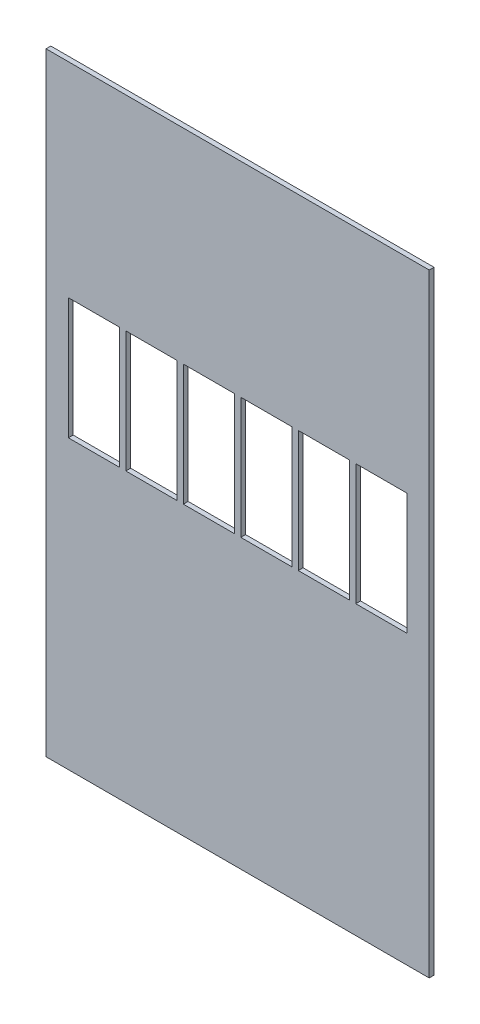
ISO-10303-21;
HEADER;
FILE_DESCRIPTION(('STEP AP214'),'2;1');
FILE_NAME('part.step','',(''),(''),'','','');
FILE_SCHEMA(('AUTOMOTIVE_DESIGN { 1 0 10303 214 1 1 1 1 }'));
ENDSEC;
DATA;
#1=APPLICATION_CONTEXT('core data for automotive mechanical design processes');
#2=APPLICATION_PROTOCOL_DEFINITION('international standard','automotive_design',2000,#1);
#3=PRODUCT_CONTEXT('',#1,'mechanical');
#4=PRODUCT('Part','Part','',(#3));
#5=PRODUCT_RELATED_PRODUCT_CATEGORY('part','',(#4));
#6=PRODUCT_DEFINITION_FORMATION('','',#4);
#7=PRODUCT_DEFINITION_CONTEXT('part definition',#1,'design');
#8=PRODUCT_DEFINITION('design','',#6,#7);
#9=PRODUCT_DEFINITION_SHAPE('','',#8);
#10=(LENGTH_UNIT() NAMED_UNIT(*) SI_UNIT(.MILLI.,.METRE.));
#11=(NAMED_UNIT(*) PLANE_ANGLE_UNIT() SI_UNIT($,.RADIAN.));
#12=(NAMED_UNIT(*) SI_UNIT($,.STERADIAN.) SOLID_ANGLE_UNIT());
#13=UNCERTAINTY_MEASURE_WITH_UNIT(LENGTH_MEASURE(1.E-05),#10,'distance_accuracy_value','');
#14=(GEOMETRIC_REPRESENTATION_CONTEXT(3) GLOBAL_UNCERTAINTY_ASSIGNED_CONTEXT((#13)) GLOBAL_UNIT_ASSIGNED_CONTEXT((#10,
#11,#12)) REPRESENTATION_CONTEXT('',''));
#15=CARTESIAN_POINT('',(0.,0.,0.));
#16=DIRECTION('',(0.,0.,1.));
#17=DIRECTION('',(1.,0.,0.));
#18=AXIS2_PLACEMENT_3D('',#15,#16,#17);
#19=CARTESIAN_POINT('',(0.,0.,38.1));
#20=DIRECTION('',(0.,0.,-1.));
#21=DIRECTION('',(-1.,0.,0.));
#22=AXIS2_PLACEMENT_3D('',#19,#20,#21);
#23=PLANE('',#22);
#24=DIRECTION('',(-1.,0.,0.));
#25=VECTOR('',#24,1.);
#26=CARTESIAN_POINT('',(0.,-482.6,38.1));
#27=LINE('',#26,#25);
#28=CARTESIAN_POINT('',(-939.8,-482.6,38.1));
#29=VERTEX_POINT('',#28);
#30=CARTESIAN_POINT('',(-1346.2,-482.6,38.1));
#31=VERTEX_POINT('',#30);
#32=EDGE_CURVE('E454',#29,#31,#27,.T.);
#33=ORIENTED_EDGE('',*,*,#32,.T.);
#34=DIRECTION('',(0.,1.,0.));
#35=VECTOR('',#34,1.);
#36=CARTESIAN_POINT('',(-1346.2,-3.09693791079649E-13,38.1));
#37=LINE('',#36,#35);
#38=CARTESIAN_POINT('',(-1346.2,482.6,38.1));
#39=VERTEX_POINT('',#38);
#40=EDGE_CURVE('E11',#31,#39,#37,.T.);
#41=ORIENTED_EDGE('',*,*,#40,.T.);
#42=DIRECTION('',(1.,0.,0.));
#43=VECTOR('',#42,1.);
#44=CARTESIAN_POINT('',(0.,482.6,38.1));
#45=LINE('',#44,#43);
#46=CARTESIAN_POINT('',(-939.8,482.6,38.1));
#47=VERTEX_POINT('',#46);
#48=EDGE_CURVE('E40',#39,#47,#45,.T.);
#49=ORIENTED_EDGE('',*,*,#48,.T.);
#50=DIRECTION('',(0.,-1.,0.));
#51=VECTOR('',#50,1.);
#52=CARTESIAN_POINT('',(-939.8,-1.08100662924028E-13,38.1));
#53=LINE('',#52,#51);
#54=EDGE_CURVE('E457',#47,#29,#53,.T.);
#55=ORIENTED_EDGE('',*,*,#54,.T.);
#56=EDGE_LOOP('',(#33,#41,#49,#55));
#57=FACE_BOUND('',#56,.T.);
#58=DIRECTION('',(-1.,0.,0.));
#59=VECTOR('',#58,1.);
#60=CARTESIAN_POINT('',(0.,-482.6,38.1));
#61=LINE('',#60,#59);
#62=CARTESIAN_POINT('',(-482.6,-482.6,38.1));
#63=VERTEX_POINT('',#62);
#64=CARTESIAN_POINT('',(-889.,-482.6,38.1));
#65=VERTEX_POINT('',#64);
#66=EDGE_CURVE('E442',#63,#65,#61,.T.);
#67=ORIENTED_EDGE('',*,*,#66,.T.);
#68=DIRECTION('',(0.,1.,0.));
#69=VECTOR('',#68,1.);
#70=CARTESIAN_POINT('',(-889.,-1.02257383847054E-13,38.1));
#71=LINE('',#70,#69);
#72=CARTESIAN_POINT('',(-889.,482.6,38.1));
#73=VERTEX_POINT('',#72);
#74=EDGE_CURVE('E451',#65,#73,#71,.T.);
#75=ORIENTED_EDGE('',*,*,#74,.T.);
#76=DIRECTION('',(1.,0.,0.));
#77=VECTOR('',#76,1.);
#78=CARTESIAN_POINT('',(0.,482.6,38.1));
#79=LINE('',#78,#77);
#80=CARTESIAN_POINT('',(-482.6,482.6,38.1));
#81=VERTEX_POINT('',#80);
#82=EDGE_CURVE('E448',#73,#81,#79,.T.);
#83=ORIENTED_EDGE('',*,*,#82,.T.);
#84=DIRECTION('',(0.,-1.,0.));
#85=VECTOR('',#84,1.);
#86=CARTESIAN_POINT('',(-482.6,0.,38.1));
#87=LINE('',#86,#85);
#88=EDGE_CURVE('E445',#81,#63,#87,.T.);
#89=ORIENTED_EDGE('',*,*,#88,.T.);
#90=EDGE_LOOP('',(#67,#75,#83,#89));
#91=FACE_BOUND('',#90,.T.);
#92=DIRECTION('',(-1.,0.,0.));
#93=VECTOR('',#92,1.);
#94=CARTESIAN_POINT('',(0.,-482.599999999999,38.1));
#95=LINE('',#94,#93);
#96=CARTESIAN_POINT('',(-25.3999999999998,-482.599999999999,38.1));
#97=VERTEX_POINT('',#96);
#98=CARTESIAN_POINT('',(-431.8,-482.599999999999,38.1));
#99=VERTEX_POINT('',#98);
#100=EDGE_CURVE('E430',#97,#99,#95,.T.);
#101=ORIENTED_EDGE('',*,*,#100,.T.);
#102=DIRECTION('',(0.,1.,0.));
#103=VECTOR('',#102,1.);
#104=CARTESIAN_POINT('',(-431.8,0.,38.1));
#105=LINE('',#104,#103);
#106=CARTESIAN_POINT('',(-431.8,482.6,38.1));
#107=VERTEX_POINT('',#106);
#108=EDGE_CURVE('E439',#99,#107,#105,.T.);
#109=ORIENTED_EDGE('',*,*,#108,.T.);
#110=DIRECTION('',(1.,0.,0.));
#111=VECTOR('',#110,1.);
#112=CARTESIAN_POINT('',(0.,482.6,38.1));
#113=LINE('',#112,#111);
#114=CARTESIAN_POINT('',(-25.3999999999998,482.6,38.1));
#115=VERTEX_POINT('',#114);
#116=EDGE_CURVE('E436',#107,#115,#113,.T.);
#117=ORIENTED_EDGE('',*,*,#116,.T.);
#118=DIRECTION('',(0.,-1.,0.));
#119=VECTOR('',#118,1.);
#120=CARTESIAN_POINT('',(-25.3999999999998,0.,38.1));
#121=LINE('',#120,#119);
#122=EDGE_CURVE('E433',#115,#97,#121,.T.);
#123=ORIENTED_EDGE('',*,*,#122,.T.);
#124=EDGE_LOOP('',(#101,#109,#117,#123));
#125=FACE_BOUND('',#124,.T.);
#126=DIRECTION('',(-1.,0.,0.));
#127=VECTOR('',#126,1.);
#128=CARTESIAN_POINT('',(0.,-482.599999999999,38.1));
#129=LINE('',#128,#127);
#130=CARTESIAN_POINT('',(431.8,-482.599999999999,38.1));
#131=VERTEX_POINT('',#130);
#132=CARTESIAN_POINT('',(25.4000000000002,-482.599999999999,38.1));
#133=VERTEX_POINT('',#132);
#134=EDGE_CURVE('E418',#131,#133,#129,.T.);
#135=ORIENTED_EDGE('',*,*,#134,.T.);
#136=DIRECTION('',(0.,1.,0.));
#137=VECTOR('',#136,1.);
#138=CARTESIAN_POINT('',(25.4000000000002,0.,38.1));
#139=LINE('',#138,#137);
#140=CARTESIAN_POINT('',(25.4000000000002,482.6,38.1));
#141=VERTEX_POINT('',#140);
#142=EDGE_CURVE('E427',#133,#141,#139,.T.);
#143=ORIENTED_EDGE('',*,*,#142,.T.);
#144=DIRECTION('',(1.,0.,0.));
#145=VECTOR('',#144,1.);
#146=CARTESIAN_POINT('',(0.,482.6,38.1));
#147=LINE('',#146,#145);
#148=CARTESIAN_POINT('',(431.8,482.6,38.1));
#149=VERTEX_POINT('',#148);
#150=EDGE_CURVE('E424',#141,#149,#147,.T.);
#151=ORIENTED_EDGE('',*,*,#150,.T.);
#152=DIRECTION('',(0.,-1.,0.));
#153=VECTOR('',#152,1.);
#154=CARTESIAN_POINT('',(431.8,0.,38.1));
#155=LINE('',#154,#153);
#156=EDGE_CURVE('E421',#149,#131,#155,.T.);
#157=ORIENTED_EDGE('',*,*,#156,.T.);
#158=EDGE_LOOP('',(#135,#143,#151,#157));
#159=FACE_BOUND('',#158,.T.);
#160=DIRECTION('',(-1.,0.,0.));
#161=VECTOR('',#160,1.);
#162=CARTESIAN_POINT('',(0.,-482.599999999999,38.1));
#163=LINE('',#162,#161);
#164=CARTESIAN_POINT('',(889.,-482.599999999999,38.1));
#165=VERTEX_POINT('',#164);
#166=CARTESIAN_POINT('',(482.6,-482.599999999999,38.1));
#167=VERTEX_POINT('',#166);
#168=EDGE_CURVE('E406',#165,#167,#163,.T.);
#169=ORIENTED_EDGE('',*,*,#168,.T.);
#170=DIRECTION('',(0.,1.,0.));
#171=VECTOR('',#170,1.);
#172=CARTESIAN_POINT('',(482.6,0.,38.1));
#173=LINE('',#172,#171);
#174=CARTESIAN_POINT('',(482.6,482.6,38.1));
#175=VERTEX_POINT('',#174);
#176=EDGE_CURVE('E415',#167,#175,#173,.T.);
#177=ORIENTED_EDGE('',*,*,#176,.T.);
#178=DIRECTION('',(1.,0.,0.));
#179=VECTOR('',#178,1.);
#180=CARTESIAN_POINT('',(0.,482.6,38.1));
#181=LINE('',#180,#179);
#182=CARTESIAN_POINT('',(889.,482.6,38.1));
#183=VERTEX_POINT('',#182);
#184=EDGE_CURVE('E412',#175,#183,#181,.T.);
#185=ORIENTED_EDGE('',*,*,#184,.T.);
#186=DIRECTION('',(0.,-1.,0.));
#187=VECTOR('',#186,1.);
#188=CARTESIAN_POINT('',(889.,0.,38.1));
#189=LINE('',#188,#187);
#190=EDGE_CURVE('E409',#183,#165,#189,.T.);
#191=ORIENTED_EDGE('',*,*,#190,.T.);
#192=EDGE_LOOP('',(#169,#177,#185,#191));
#193=FACE_BOUND('',#192,.T.);
#194=DIRECTION('',(-1.,0.,0.));
#195=VECTOR('',#194,1.);
#196=CARTESIAN_POINT('',(0.,-482.599999999999,38.1));
#197=LINE('',#196,#195);
#198=CARTESIAN_POINT('',(1346.2,-482.599999999999,38.1));
#199=VERTEX_POINT('',#198);
#200=CARTESIAN_POINT('',(939.8,-482.599999999999,38.1));
#201=VERTEX_POINT('',#200);
#202=EDGE_CURVE('E275',#199,#201,#197,.T.);
#203=ORIENTED_EDGE('',*,*,#202,.T.);
#204=DIRECTION('',(0.,1.,0.));
#205=VECTOR('',#204,1.);
#206=CARTESIAN_POINT('',(939.8,0.,38.1));
#207=LINE('',#206,#205);
#208=CARTESIAN_POINT('',(939.8,482.6,38.1));
#209=VERTEX_POINT('',#208);
#210=EDGE_CURVE('E403',#201,#209,#207,.T.);
#211=ORIENTED_EDGE('',*,*,#210,.T.);
#212=DIRECTION('',(1.,0.,0.));
#213=VECTOR('',#212,1.);
#214=CARTESIAN_POINT('',(0.,482.6,38.1));
#215=LINE('',#214,#213);
#216=CARTESIAN_POINT('',(1346.2,482.6,38.1));
#217=VERTEX_POINT('',#216);
#218=EDGE_CURVE('E400',#209,#217,#215,.T.);
#219=ORIENTED_EDGE('',*,*,#218,.T.);
#220=DIRECTION('',(0.,-1.,0.));
#221=VECTOR('',#220,1.);
#222=CARTESIAN_POINT('',(1346.2,0.,38.1));
#223=LINE('',#222,#221);
#224=EDGE_CURVE('E397',#217,#199,#223,.T.);
#225=ORIENTED_EDGE('',*,*,#224,.T.);
#226=EDGE_LOOP('',(#203,#211,#219,#225));
#227=FACE_BOUND('',#226,.T.);
#228=DIRECTION('',(-1.,0.,0.));
#229=VECTOR('',#228,1.);
#230=CARTESIAN_POINT('',(-1371.6,-2768.6,38.1));
#231=LINE('',#230,#229);
#232=CARTESIAN_POINT('',(1524.,-2768.6,38.1));
#233=VERTEX_POINT('',#232);
#234=CARTESIAN_POINT('',(-1524.,-2768.6,38.1));
#235=VERTEX_POINT('',#234);
#236=EDGE_CURVE('E256',#233,#235,#231,.T.);
#237=ORIENTED_EDGE('',*,*,#236,.F.);
#238=DIRECTION('',(0.,1.,0.));
#239=VECTOR('',#238,1.);
#240=CARTESIAN_POINT('',(1524.,2108.2,38.0999999999994));
#241=LINE('',#240,#239);
#242=CARTESIAN_POINT('',(1524.,2108.2,38.0999999999994));
#243=VERTEX_POINT('',#242);
#244=EDGE_CURVE('E240',#233,#243,#241,.T.);
#245=ORIENTED_EDGE('',*,*,#244,.T.);
#246=DIRECTION('',(1.,0.,0.));
#247=VECTOR('',#246,1.);
#248=CARTESIAN_POINT('',(-1371.6,2108.2,38.1));
#249=LINE('',#248,#247);
#250=CARTESIAN_POINT('',(-1524.,2108.2,38.0999999999994));
#251=VERTEX_POINT('',#250);
#252=EDGE_CURVE('E228',#251,#243,#249,.T.);
#253=ORIENTED_EDGE('',*,*,#252,.F.);
#254=DIRECTION('',(0.,1.,0.));
#255=VECTOR('',#254,1.);
#256=CARTESIAN_POINT('',(-1524.,2108.2,38.0999999999994));
#257=LINE('',#256,#255);
#258=EDGE_CURVE('E249',#235,#251,#257,.T.);
#259=ORIENTED_EDGE('',*,*,#258,.F.);
#260=EDGE_LOOP('',(#237,#245,#253,#259));
#261=FACE_BOUND('',#260,.T.);
#262=ADVANCED_FACE('F32',(#57,#91,#125,#159,#193,#227,#261),#23,.F.);
#263=CARTESIAN_POINT('',(0.,0.,0.));
#264=DIRECTION('',(0.,0.,-1.));
#265=DIRECTION('',(-1.,0.,0.));
#266=AXIS2_PLACEMENT_3D('',#263,#264,#265);
#267=PLANE('',#266);
#268=DIRECTION('',(0.,-1.,0.));
#269=VECTOR('',#268,1.);
#270=CARTESIAN_POINT('',(-1346.2,482.6,0.));
#271=LINE('',#270,#269);
#272=CARTESIAN_POINT('',(-1346.2,482.6,0.));
#273=VERTEX_POINT('',#272);
#274=CARTESIAN_POINT('',(-1346.2,-482.6,0.));
#275=VERTEX_POINT('',#274);
#276=EDGE_CURVE('E259',#273,#275,#271,.T.);
#277=ORIENTED_EDGE('',*,*,#276,.T.);
#278=DIRECTION('',(1.,0.,0.));
#279=VECTOR('',#278,1.);
#280=CARTESIAN_POINT('',(-1346.2,-482.6,0.));
#281=LINE('',#280,#279);
#282=CARTESIAN_POINT('',(-939.8,-482.6,0.));
#283=VERTEX_POINT('',#282);
#284=EDGE_CURVE('E262',#275,#283,#281,.T.);
#285=ORIENTED_EDGE('',*,*,#284,.T.);
#286=DIRECTION('',(0.,1.,0.));
#287=VECTOR('',#286,1.);
#288=CARTESIAN_POINT('',(-939.8,482.6,0.));
#289=LINE('',#288,#287);
#290=CARTESIAN_POINT('',(-939.8,482.6,0.));
#291=VERTEX_POINT('',#290);
#292=EDGE_CURVE('E266',#283,#291,#289,.T.);
#293=ORIENTED_EDGE('',*,*,#292,.T.);
#294=DIRECTION('',(-1.,0.,0.));
#295=VECTOR('',#294,1.);
#296=CARTESIAN_POINT('',(-1346.2,482.6,0.));
#297=LINE('',#296,#295);
#298=EDGE_CURVE('E269',#291,#273,#297,.T.);
#299=ORIENTED_EDGE('',*,*,#298,.T.);
#300=EDGE_LOOP('',(#277,#285,#293,#299));
#301=FACE_BOUND('',#300,.T.);
#302=DIRECTION('',(0.,-1.,0.));
#303=VECTOR('',#302,1.);
#304=CARTESIAN_POINT('',(-889.,482.6,0.));
#305=LINE('',#304,#303);
#306=CARTESIAN_POINT('',(-889.,482.6,0.));
#307=VERTEX_POINT('',#306);
#308=CARTESIAN_POINT('',(-889.,-482.6,0.));
#309=VERTEX_POINT('',#308);
#310=EDGE_CURVE('E283',#307,#309,#305,.T.);
#311=ORIENTED_EDGE('',*,*,#310,.T.);
#312=DIRECTION('',(1.,0.,0.));
#313=VECTOR('',#312,1.);
#314=CARTESIAN_POINT('',(-889.,-482.6,0.));
#315=LINE('',#314,#313);
#316=CARTESIAN_POINT('',(-482.6,-482.6,0.));
#317=VERTEX_POINT('',#316);
#318=EDGE_CURVE('E286',#309,#317,#315,.T.);
#319=ORIENTED_EDGE('',*,*,#318,.T.);
#320=DIRECTION('',(0.,1.,0.));
#321=VECTOR('',#320,1.);
#322=CARTESIAN_POINT('',(-482.6,482.6,0.));
#323=LINE('',#322,#321);
#324=CARTESIAN_POINT('',(-482.6,482.6,0.));
#325=VERTEX_POINT('',#324);
#326=EDGE_CURVE('E290',#317,#325,#323,.T.);
#327=ORIENTED_EDGE('',*,*,#326,.T.);
#328=DIRECTION('',(-1.,0.,0.));
#329=VECTOR('',#328,1.);
#330=CARTESIAN_POINT('',(-889.,482.6,0.));
#331=LINE('',#330,#329);
#332=EDGE_CURVE('E293',#325,#307,#331,.T.);
#333=ORIENTED_EDGE('',*,*,#332,.T.);
#334=EDGE_LOOP('',(#311,#319,#327,#333));
#335=FACE_BOUND('',#334,.T.);
#336=DIRECTION('',(0.,-1.,0.));
#337=VECTOR('',#336,1.);
#338=CARTESIAN_POINT('',(-431.8,-482.599999999999,0.));
#339=LINE('',#338,#337);
#340=CARTESIAN_POINT('',(-431.8,482.6,0.));
#341=VERTEX_POINT('',#340);
#342=CARTESIAN_POINT('',(-431.8,-482.599999999999,0.));
#343=VERTEX_POINT('',#342);
#344=EDGE_CURVE('E305',#341,#343,#339,.T.);
#345=ORIENTED_EDGE('',*,*,#344,.T.);
#346=DIRECTION('',(1.,0.,0.));
#347=VECTOR('',#346,1.);
#348=CARTESIAN_POINT('',(-431.8,-482.599999999999,0.));
#349=LINE('',#348,#347);
#350=CARTESIAN_POINT('',(-25.3999999999998,-482.599999999999,0.));
#351=VERTEX_POINT('',#350);
#352=EDGE_CURVE('E308',#343,#351,#349,.T.);
#353=ORIENTED_EDGE('',*,*,#352,.T.);
#354=DIRECTION('',(0.,1.,0.));
#355=VECTOR('',#354,1.);
#356=CARTESIAN_POINT('',(-25.3999999999998,-482.599999999999,0.));
#357=LINE('',#356,#355);
#358=CARTESIAN_POINT('',(-25.3999999999998,482.6,0.));
#359=VERTEX_POINT('',#358);
#360=EDGE_CURVE('E312',#351,#359,#357,.T.);
#361=ORIENTED_EDGE('',*,*,#360,.T.);
#362=DIRECTION('',(-1.,0.,0.));
#363=VECTOR('',#362,1.);
#364=CARTESIAN_POINT('',(-431.8,482.6,0.));
#365=LINE('',#364,#363);
#366=EDGE_CURVE('E315',#359,#341,#365,.T.);
#367=ORIENTED_EDGE('',*,*,#366,.T.);
#368=EDGE_LOOP('',(#345,#353,#361,#367));
#369=FACE_BOUND('',#368,.T.);
#370=DIRECTION('',(0.,-1.,0.));
#371=VECTOR('',#370,1.);
#372=CARTESIAN_POINT('',(25.4000000000002,-482.599999999999,0.));
#373=LINE('',#372,#371);
#374=CARTESIAN_POINT('',(25.4000000000002,482.6,0.));
#375=VERTEX_POINT('',#374);
#376=CARTESIAN_POINT('',(25.4000000000002,-482.599999999999,0.));
#377=VERTEX_POINT('',#376);
#378=EDGE_CURVE('E328',#375,#377,#373,.T.);
#379=ORIENTED_EDGE('',*,*,#378,.T.);
#380=DIRECTION('',(1.,0.,0.));
#381=VECTOR('',#380,1.);
#382=CARTESIAN_POINT('',(25.4000000000002,-482.599999999999,0.));
#383=LINE('',#382,#381);
#384=CARTESIAN_POINT('',(431.8,-482.599999999999,0.));
#385=VERTEX_POINT('',#384);
#386=EDGE_CURVE('E331',#377,#385,#383,.T.);
#387=ORIENTED_EDGE('',*,*,#386,.T.);
#388=DIRECTION('',(0.,1.,0.));
#389=VECTOR('',#388,1.);
#390=CARTESIAN_POINT('',(431.8,-482.599999999999,0.));
#391=LINE('',#390,#389);
#392=CARTESIAN_POINT('',(431.8,482.6,0.));
#393=VERTEX_POINT('',#392);
#394=EDGE_CURVE('E335',#385,#393,#391,.T.);
#395=ORIENTED_EDGE('',*,*,#394,.T.);
#396=DIRECTION('',(-1.,0.,0.));
#397=VECTOR('',#396,1.);
#398=CARTESIAN_POINT('',(25.4000000000002,482.6,0.));
#399=LINE('',#398,#397);
#400=EDGE_CURVE('E338',#393,#375,#399,.T.);
#401=ORIENTED_EDGE('',*,*,#400,.T.);
#402=EDGE_LOOP('',(#379,#387,#395,#401));
#403=FACE_BOUND('',#402,.T.);
#404=DIRECTION('',(0.,-1.,0.));
#405=VECTOR('',#404,1.);
#406=CARTESIAN_POINT('',(482.6,-482.599999999999,0.));
#407=LINE('',#406,#405);
#408=CARTESIAN_POINT('',(482.6,482.6,0.));
#409=VERTEX_POINT('',#408);
#410=CARTESIAN_POINT('',(482.6,-482.599999999999,0.));
#411=VERTEX_POINT('',#410);
#412=EDGE_CURVE('E351',#409,#411,#407,.T.);
#413=ORIENTED_EDGE('',*,*,#412,.T.);
#414=DIRECTION('',(1.,0.,0.));
#415=VECTOR('',#414,1.);
#416=CARTESIAN_POINT('',(482.6,-482.599999999999,0.));
#417=LINE('',#416,#415);
#418=CARTESIAN_POINT('',(889.,-482.599999999999,0.));
#419=VERTEX_POINT('',#418);
#420=EDGE_CURVE('E354',#411,#419,#417,.T.);
#421=ORIENTED_EDGE('',*,*,#420,.T.);
#422=DIRECTION('',(0.,1.,0.));
#423=VECTOR('',#422,1.);
#424=CARTESIAN_POINT('',(889.,-482.599999999999,0.));
#425=LINE('',#424,#423);
#426=CARTESIAN_POINT('',(889.,482.6,0.));
#427=VERTEX_POINT('',#426);
#428=EDGE_CURVE('E358',#419,#427,#425,.T.);
#429=ORIENTED_EDGE('',*,*,#428,.T.);
#430=DIRECTION('',(-1.,0.,0.));
#431=VECTOR('',#430,1.);
#432=CARTESIAN_POINT('',(482.6,482.6,0.));
#433=LINE('',#432,#431);
#434=EDGE_CURVE('E361',#427,#409,#433,.T.);
#435=ORIENTED_EDGE('',*,*,#434,.T.);
#436=EDGE_LOOP('',(#413,#421,#429,#435));
#437=FACE_BOUND('',#436,.T.);
#438=DIRECTION('',(0.,-1.,0.));
#439=VECTOR('',#438,1.);
#440=CARTESIAN_POINT('',(939.8,-482.599999999999,0.));
#441=LINE('',#440,#439);
#442=CARTESIAN_POINT('',(939.8,482.6,0.));
#443=VERTEX_POINT('',#442);
#444=CARTESIAN_POINT('',(939.8,-482.599999999999,0.));
#445=VERTEX_POINT('',#444);
#446=EDGE_CURVE('E258',#443,#445,#441,.T.);
#447=ORIENTED_EDGE('',*,*,#446,.T.);
#448=DIRECTION('',(1.,0.,0.));
#449=VECTOR('',#448,1.);
#450=CARTESIAN_POINT('',(939.8,-482.599999999999,0.));
#451=LINE('',#450,#449);
#452=CARTESIAN_POINT('',(1346.2,-482.599999999999,0.));
#453=VERTEX_POINT('',#452);
#454=EDGE_CURVE('E376',#445,#453,#451,.T.);
#455=ORIENTED_EDGE('',*,*,#454,.T.);
#456=DIRECTION('',(0.,1.,0.));
#457=VECTOR('',#456,1.);
#458=CARTESIAN_POINT('',(1346.2,-482.599999999999,0.));
#459=LINE('',#458,#457);
#460=CARTESIAN_POINT('',(1346.2,482.6,0.));
#461=VERTEX_POINT('',#460);
#462=EDGE_CURVE('E379',#453,#461,#459,.T.);
#463=ORIENTED_EDGE('',*,*,#462,.T.);
#464=DIRECTION('',(-1.,0.,0.));
#465=VECTOR('',#464,1.);
#466=CARTESIAN_POINT('',(939.8,482.6,0.));
#467=LINE('',#466,#465);
#468=EDGE_CURVE('E382',#461,#443,#467,.T.);
#469=ORIENTED_EDGE('',*,*,#468,.T.);
#470=EDGE_LOOP('',(#447,#455,#463,#469));
#471=FACE_BOUND('',#470,.T.);
#472=DIRECTION('',(-1.,0.,0.));
#473=VECTOR('',#472,1.);
#474=CARTESIAN_POINT('',(-1371.6,2108.2,0.));
#475=LINE('',#474,#473);
#476=CARTESIAN_POINT('',(1524.,2108.2,0.));
#477=VERTEX_POINT('',#476);
#478=CARTESIAN_POINT('',(-1524.,2108.2,0.));
#479=VERTEX_POINT('',#478);
#480=EDGE_CURVE('E217',#477,#479,#475,.T.);
#481=ORIENTED_EDGE('',*,*,#480,.F.);
#482=DIRECTION('',(0.,-1.,0.));
#483=VECTOR('',#482,1.);
#484=CARTESIAN_POINT('',(1524.,2108.2,0.));
#485=LINE('',#484,#483);
#486=CARTESIAN_POINT('',(1524.,-2768.6,5.97235751008181E-13));
#487=VERTEX_POINT('',#486);
#488=EDGE_CURVE('E219',#477,#487,#485,.T.);
#489=ORIENTED_EDGE('',*,*,#488,.T.);
#490=DIRECTION('',(1.,0.,0.));
#491=VECTOR('',#490,1.);
#492=CARTESIAN_POINT('',(-1371.6,-2768.6,0.));
#493=LINE('',#492,#491);
#494=CARTESIAN_POINT('',(-1524.,-2768.6,5.97235751008181E-13));
#495=VERTEX_POINT('',#494);
#496=EDGE_CURVE('E227',#495,#487,#493,.T.);
#497=ORIENTED_EDGE('',*,*,#496,.F.);
#498=DIRECTION('',(0.,-1.,0.));
#499=VECTOR('',#498,1.);
#500=CARTESIAN_POINT('',(-1524.,2108.2,0.));
#501=LINE('',#500,#499);
#502=EDGE_CURVE('E222',#479,#495,#501,.T.);
#503=ORIENTED_EDGE('',*,*,#502,.F.);
#504=EDGE_LOOP('',(#481,#489,#497,#503));
#505=FACE_BOUND('',#504,.T.);
#506=ADVANCED_FACE('F34',(#301,#335,#369,#403,#437,#471,#505),#267,.T.);
#507=CARTESIAN_POINT('',(939.8,-482.599999999999,0.));
#508=DIRECTION('',(-1.,0.,0.));
#509=DIRECTION('',(0.,0.,1.));
#510=AXIS2_PLACEMENT_3D('',#507,#508,#509);
#511=PLANE('',#510);
#512=DIRECTION('',(0.,0.,1.));
#513=VECTOR('',#512,1.);
#514=CARTESIAN_POINT('',(939.8,-482.599999999999,0.));
#515=LINE('',#514,#513);
#516=EDGE_CURVE('E385',#445,#201,#515,.T.);
#517=ORIENTED_EDGE('',*,*,#516,.F.);
#518=ORIENTED_EDGE('',*,*,#446,.F.);
#519=DIRECTION('',(0.,0.,1.));
#520=VECTOR('',#519,1.);
#521=CARTESIAN_POINT('',(939.8,482.6,0.));
#522=LINE('',#521,#520);
#523=EDGE_CURVE('E355',#443,#209,#522,.T.);
#524=ORIENTED_EDGE('',*,*,#523,.T.);
#525=ORIENTED_EDGE('',*,*,#210,.F.);
#526=EDGE_LOOP('',(#517,#518,#524,#525));
#527=FACE_BOUND('',#526,.T.);
#528=ADVANCED_FACE('F489',(#527),#511,.F.);
#529=CARTESIAN_POINT('',(939.8,482.6,0.));
#530=DIRECTION('',(0.,1.,0.));
#531=DIRECTION('',(0.,0.,1.));
#532=AXIS2_PLACEMENT_3D('',#529,#530,#531);
#533=PLANE('',#532);
#534=ORIENTED_EDGE('',*,*,#523,.F.);
#535=ORIENTED_EDGE('',*,*,#468,.F.);
#536=DIRECTION('',(0.,0.,1.));
#537=VECTOR('',#536,1.);
#538=CARTESIAN_POINT('',(1346.2,482.6,0.));
#539=LINE('',#538,#537);
#540=EDGE_CURVE('E388',#461,#217,#539,.T.);
#541=ORIENTED_EDGE('',*,*,#540,.T.);
#542=ORIENTED_EDGE('',*,*,#218,.F.);
#543=EDGE_LOOP('',(#534,#535,#541,#542));
#544=FACE_BOUND('',#543,.T.);
#545=ADVANCED_FACE('F493',(#544),#533,.F.);
#546=CARTESIAN_POINT('',(1346.2,-482.599999999999,0.));
#547=DIRECTION('',(1.,0.,0.));
#548=DIRECTION('',(0.,0.,-1.));
#549=AXIS2_PLACEMENT_3D('',#546,#547,#548);
#550=PLANE('',#549);
#551=ORIENTED_EDGE('',*,*,#540,.F.);
#552=ORIENTED_EDGE('',*,*,#462,.F.);
#553=DIRECTION('',(0.,0.,1.));
#554=VECTOR('',#553,1.);
#555=CARTESIAN_POINT('',(1346.2,-482.599999999999,0.));
#556=LINE('',#555,#554);
#557=EDGE_CURVE('E391',#453,#199,#556,.T.);
#558=ORIENTED_EDGE('',*,*,#557,.T.);
#559=ORIENTED_EDGE('',*,*,#224,.F.);
#560=EDGE_LOOP('',(#551,#552,#558,#559));
#561=FACE_BOUND('',#560,.T.);
#562=ADVANCED_FACE('F499',(#561),#550,.F.);
#563=CARTESIAN_POINT('',(939.8,-482.599999999999,0.));
#564=DIRECTION('',(0.,-1.,0.));
#565=DIRECTION('',(0.,0.,-1.));
#566=AXIS2_PLACEMENT_3D('',#563,#564,#565);
#567=PLANE('',#566);
#568=ORIENTED_EDGE('',*,*,#557,.F.);
#569=ORIENTED_EDGE('',*,*,#454,.F.);
#570=ORIENTED_EDGE('',*,*,#516,.T.);
#571=ORIENTED_EDGE('',*,*,#202,.F.);
#572=EDGE_LOOP('',(#568,#569,#570,#571));
#573=FACE_BOUND('',#572,.T.);
#574=ADVANCED_FACE('F495',(#573),#567,.F.);
#575=CARTESIAN_POINT('',(482.6,-482.599999999999,0.));
#576=DIRECTION('',(-1.,0.,0.));
#577=DIRECTION('',(0.,0.,1.));
#578=AXIS2_PLACEMENT_3D('',#575,#576,#577);
#579=PLANE('',#578);
#580=DIRECTION('',(0.,0.,1.));
#581=VECTOR('',#580,1.);
#582=CARTESIAN_POINT('',(482.6,-482.599999999999,0.));
#583=LINE('',#582,#581);
#584=EDGE_CURVE('E364',#411,#167,#583,.T.);
#585=ORIENTED_EDGE('',*,*,#584,.F.);
#586=ORIENTED_EDGE('',*,*,#412,.F.);
#587=DIRECTION('',(0.,0.,1.));
#588=VECTOR('',#587,1.);
#589=CARTESIAN_POINT('',(482.6,482.6,0.));
#590=LINE('',#589,#588);
#591=EDGE_CURVE('E332',#409,#175,#590,.T.);
#592=ORIENTED_EDGE('',*,*,#591,.T.);
#593=ORIENTED_EDGE('',*,*,#176,.F.);
#594=EDGE_LOOP('',(#585,#586,#592,#593));
#595=FACE_BOUND('',#594,.T.);
#596=ADVANCED_FACE('F498',(#595),#579,.F.);
#597=CARTESIAN_POINT('',(482.6,482.6,0.));
#598=DIRECTION('',(0.,1.,0.));
#599=DIRECTION('',(0.,0.,1.));
#600=AXIS2_PLACEMENT_3D('',#597,#598,#599);
#601=PLANE('',#600);
#602=ORIENTED_EDGE('',*,*,#591,.F.);
#603=ORIENTED_EDGE('',*,*,#434,.F.);
#604=DIRECTION('',(0.,0.,1.));
#605=VECTOR('',#604,1.);
#606=CARTESIAN_POINT('',(889.,482.6,0.));
#607=LINE('',#606,#605);
#608=EDGE_CURVE('E367',#427,#183,#607,.T.);
#609=ORIENTED_EDGE('',*,*,#608,.T.);
#610=ORIENTED_EDGE('',*,*,#184,.F.);
#611=EDGE_LOOP('',(#602,#603,#609,#610));
#612=FACE_BOUND('',#611,.T.);
#613=ADVANCED_FACE('F509',(#612),#601,.F.);
#614=CARTESIAN_POINT('',(889.,-482.599999999999,0.));
#615=DIRECTION('',(1.,0.,0.));
#616=DIRECTION('',(0.,0.,-1.));
#617=AXIS2_PLACEMENT_3D('',#614,#615,#616);
#618=PLANE('',#617);
#619=ORIENTED_EDGE('',*,*,#608,.F.);
#620=ORIENTED_EDGE('',*,*,#428,.F.);
#621=DIRECTION('',(0.,0.,1.));
#622=VECTOR('',#621,1.);
#623=CARTESIAN_POINT('',(889.,-482.599999999999,0.));
#624=LINE('',#623,#622);
#625=EDGE_CURVE('E370',#419,#165,#624,.T.);
#626=ORIENTED_EDGE('',*,*,#625,.T.);
#627=ORIENTED_EDGE('',*,*,#190,.F.);
#628=EDGE_LOOP('',(#619,#620,#626,#627));
#629=FACE_BOUND('',#628,.T.);
#630=ADVANCED_FACE('F515',(#629),#618,.F.);
#631=CARTESIAN_POINT('',(482.6,-482.599999999999,0.));
#632=DIRECTION('',(0.,-1.,0.));
#633=DIRECTION('',(0.,0.,-1.));
#634=AXIS2_PLACEMENT_3D('',#631,#632,#633);
#635=PLANE('',#634);
#636=ORIENTED_EDGE('',*,*,#625,.F.);
#637=ORIENTED_EDGE('',*,*,#420,.F.);
#638=ORIENTED_EDGE('',*,*,#584,.T.);
#639=ORIENTED_EDGE('',*,*,#168,.F.);
#640=EDGE_LOOP('',(#636,#637,#638,#639));
#641=FACE_BOUND('',#640,.T.);
#642=ADVANCED_FACE('F511',(#641),#635,.F.);
#643=CARTESIAN_POINT('',(25.4000000000002,-482.599999999999,0.));
#644=DIRECTION('',(-1.,0.,0.));
#645=DIRECTION('',(0.,0.,1.));
#646=AXIS2_PLACEMENT_3D('',#643,#644,#645);
#647=PLANE('',#646);
#648=DIRECTION('',(0.,0.,1.));
#649=VECTOR('',#648,1.);
#650=CARTESIAN_POINT('',(25.4000000000002,-482.599999999999,0.));
#651=LINE('',#650,#649);
#652=EDGE_CURVE('E341',#377,#133,#651,.T.);
#653=ORIENTED_EDGE('',*,*,#652,.F.);
#654=ORIENTED_EDGE('',*,*,#378,.F.);
#655=DIRECTION('',(0.,0.,1.));
#656=VECTOR('',#655,1.);
#657=CARTESIAN_POINT('',(25.4000000000002,482.6,0.));
#658=LINE('',#657,#656);
#659=EDGE_CURVE('E309',#375,#141,#658,.T.);
#660=ORIENTED_EDGE('',*,*,#659,.T.);
#661=ORIENTED_EDGE('',*,*,#142,.F.);
#662=EDGE_LOOP('',(#653,#654,#660,#661));
#663=FACE_BOUND('',#662,.T.);
#664=ADVANCED_FACE('F514',(#663),#647,.F.);
#665=CARTESIAN_POINT('',(25.4000000000002,482.6,0.));
#666=DIRECTION('',(0.,1.,0.));
#667=DIRECTION('',(0.,0.,1.));
#668=AXIS2_PLACEMENT_3D('',#665,#666,#667);
#669=PLANE('',#668);
#670=ORIENTED_EDGE('',*,*,#659,.F.);
#671=ORIENTED_EDGE('',*,*,#400,.F.);
#672=DIRECTION('',(0.,0.,1.));
#673=VECTOR('',#672,1.);
#674=CARTESIAN_POINT('',(431.8,482.6,0.));
#675=LINE('',#674,#673);
#676=EDGE_CURVE('E344',#393,#149,#675,.T.);
#677=ORIENTED_EDGE('',*,*,#676,.T.);
#678=ORIENTED_EDGE('',*,*,#150,.F.);
#679=EDGE_LOOP('',(#670,#671,#677,#678));
#680=FACE_BOUND('',#679,.T.);
#681=ADVANCED_FACE('F525',(#680),#669,.F.);
#682=CARTESIAN_POINT('',(431.8,-482.599999999999,0.));
#683=DIRECTION('',(1.,0.,0.));
#684=DIRECTION('',(0.,0.,-1.));
#685=AXIS2_PLACEMENT_3D('',#682,#683,#684);
#686=PLANE('',#685);
#687=ORIENTED_EDGE('',*,*,#676,.F.);
#688=ORIENTED_EDGE('',*,*,#394,.F.);
#689=DIRECTION('',(0.,0.,1.));
#690=VECTOR('',#689,1.);
#691=CARTESIAN_POINT('',(431.8,-482.599999999999,0.));
#692=LINE('',#691,#690);
#693=EDGE_CURVE('E347',#385,#131,#692,.T.);
#694=ORIENTED_EDGE('',*,*,#693,.T.);
#695=ORIENTED_EDGE('',*,*,#156,.F.);
#696=EDGE_LOOP('',(#687,#688,#694,#695));
#697=FACE_BOUND('',#696,.T.);
#698=ADVANCED_FACE('F531',(#697),#686,.F.);
#699=CARTESIAN_POINT('',(25.4000000000002,-482.599999999999,0.));
#700=DIRECTION('',(0.,-1.,0.));
#701=DIRECTION('',(0.,0.,-1.));
#702=AXIS2_PLACEMENT_3D('',#699,#700,#701);
#703=PLANE('',#702);
#704=ORIENTED_EDGE('',*,*,#693,.F.);
#705=ORIENTED_EDGE('',*,*,#386,.F.);
#706=ORIENTED_EDGE('',*,*,#652,.T.);
#707=ORIENTED_EDGE('',*,*,#134,.F.);
#708=EDGE_LOOP('',(#704,#705,#706,#707));
#709=FACE_BOUND('',#708,.T.);
#710=ADVANCED_FACE('F527',(#709),#703,.F.);
#711=CARTESIAN_POINT('',(-431.8,-482.599999999999,0.));
#712=DIRECTION('',(-1.,0.,0.));
#713=DIRECTION('',(0.,0.,1.));
#714=AXIS2_PLACEMENT_3D('',#711,#712,#713);
#715=PLANE('',#714);
#716=DIRECTION('',(0.,0.,1.));
#717=VECTOR('',#716,1.);
#718=CARTESIAN_POINT('',(-431.8,-482.599999999999,0.));
#719=LINE('',#718,#717);
#720=EDGE_CURVE('E318',#343,#99,#719,.T.);
#721=ORIENTED_EDGE('',*,*,#720,.F.);
#722=ORIENTED_EDGE('',*,*,#344,.F.);
#723=DIRECTION('',(0.,0.,1.));
#724=VECTOR('',#723,1.);
#725=CARTESIAN_POINT('',(-431.8,482.6,0.));
#726=LINE('',#725,#724);
#727=EDGE_CURVE('E287',#341,#107,#726,.T.);
#728=ORIENTED_EDGE('',*,*,#727,.T.);
#729=ORIENTED_EDGE('',*,*,#108,.F.);
#730=EDGE_LOOP('',(#721,#722,#728,#729));
#731=FACE_BOUND('',#730,.T.);
#732=ADVANCED_FACE('F530',(#731),#715,.F.);
#733=CARTESIAN_POINT('',(-431.8,482.6,0.));
#734=DIRECTION('',(0.,1.,0.));
#735=DIRECTION('',(0.,0.,1.));
#736=AXIS2_PLACEMENT_3D('',#733,#734,#735);
#737=PLANE('',#736);
#738=ORIENTED_EDGE('',*,*,#727,.F.);
#739=ORIENTED_EDGE('',*,*,#366,.F.);
#740=DIRECTION('',(0.,0.,1.));
#741=VECTOR('',#740,1.);
#742=CARTESIAN_POINT('',(-25.3999999999998,482.6,0.));
#743=LINE('',#742,#741);
#744=EDGE_CURVE('E321',#359,#115,#743,.T.);
#745=ORIENTED_EDGE('',*,*,#744,.T.);
#746=ORIENTED_EDGE('',*,*,#116,.F.);
#747=EDGE_LOOP('',(#738,#739,#745,#746));
#748=FACE_BOUND('',#747,.T.);
#749=ADVANCED_FACE('F541',(#748),#737,.F.);
#750=CARTESIAN_POINT('',(-25.3999999999998,-482.599999999999,0.));
#751=DIRECTION('',(1.,0.,0.));
#752=DIRECTION('',(0.,0.,-1.));
#753=AXIS2_PLACEMENT_3D('',#750,#751,#752);
#754=PLANE('',#753);
#755=ORIENTED_EDGE('',*,*,#744,.F.);
#756=ORIENTED_EDGE('',*,*,#360,.F.);
#757=DIRECTION('',(0.,0.,1.));
#758=VECTOR('',#757,1.);
#759=CARTESIAN_POINT('',(-25.3999999999998,-482.599999999999,0.));
#760=LINE('',#759,#758);
#761=EDGE_CURVE('E324',#351,#97,#760,.T.);
#762=ORIENTED_EDGE('',*,*,#761,.T.);
#763=ORIENTED_EDGE('',*,*,#122,.F.);
#764=EDGE_LOOP('',(#755,#756,#762,#763));
#765=FACE_BOUND('',#764,.T.);
#766=ADVANCED_FACE('F547',(#765),#754,.F.);
#767=CARTESIAN_POINT('',(-431.8,-482.599999999999,0.));
#768=DIRECTION('',(0.,-1.,0.));
#769=DIRECTION('',(0.,0.,-1.));
#770=AXIS2_PLACEMENT_3D('',#767,#768,#769);
#771=PLANE('',#770);
#772=ORIENTED_EDGE('',*,*,#761,.F.);
#773=ORIENTED_EDGE('',*,*,#352,.F.);
#774=ORIENTED_EDGE('',*,*,#720,.T.);
#775=ORIENTED_EDGE('',*,*,#100,.F.);
#776=EDGE_LOOP('',(#772,#773,#774,#775));
#777=FACE_BOUND('',#776,.T.);
#778=ADVANCED_FACE('F543',(#777),#771,.F.);
#779=CARTESIAN_POINT('',(-889.,482.6,0.));
#780=DIRECTION('',(-1.,0.,0.));
#781=DIRECTION('',(0.,-1.,0.));
#782=AXIS2_PLACEMENT_3D('',#779,#780,#781);
#783=PLANE('',#782);
#784=DIRECTION('',(0.,0.,1.));
#785=VECTOR('',#784,1.);
#786=CARTESIAN_POINT('',(-889.,-482.6,0.));
#787=LINE('',#786,#785);
#788=EDGE_CURVE('E55',#309,#65,#787,.T.);
#789=ORIENTED_EDGE('',*,*,#788,.F.);
#790=ORIENTED_EDGE('',*,*,#310,.F.);
#791=DIRECTION('',(0.,0.,1.));
#792=VECTOR('',#791,1.);
#793=CARTESIAN_POINT('',(-889.,482.6,0.));
#794=LINE('',#793,#792);
#795=EDGE_CURVE('E263',#307,#73,#794,.T.);
#796=ORIENTED_EDGE('',*,*,#795,.T.);
#797=ORIENTED_EDGE('',*,*,#74,.F.);
#798=EDGE_LOOP('',(#789,#790,#796,#797));
#799=FACE_BOUND('',#798,.T.);
#800=ADVANCED_FACE('F546',(#799),#783,.F.);
#801=CARTESIAN_POINT('',(-889.,482.6,0.));
#802=DIRECTION('',(0.,1.,0.));
#803=DIRECTION('',(-1.,0.,0.));
#804=AXIS2_PLACEMENT_3D('',#801,#802,#803);
#805=PLANE('',#804);
#806=ORIENTED_EDGE('',*,*,#795,.F.);
#807=ORIENTED_EDGE('',*,*,#332,.F.);
#808=DIRECTION('',(0.,0.,1.));
#809=VECTOR('',#808,1.);
#810=CARTESIAN_POINT('',(-482.6,482.6,0.));
#811=LINE('',#810,#809);
#812=EDGE_CURVE('E298',#325,#81,#811,.T.);
#813=ORIENTED_EDGE('',*,*,#812,.T.);
#814=ORIENTED_EDGE('',*,*,#82,.F.);
#815=EDGE_LOOP('',(#806,#807,#813,#814));
#816=FACE_BOUND('',#815,.T.);
#817=ADVANCED_FACE('F557',(#816),#805,.F.);
#818=CARTESIAN_POINT('',(-482.6,482.6,0.));
#819=DIRECTION('',(1.,0.,0.));
#820=DIRECTION('',(0.,1.,0.));
#821=AXIS2_PLACEMENT_3D('',#818,#819,#820);
#822=PLANE('',#821);
#823=ORIENTED_EDGE('',*,*,#812,.F.);
#824=ORIENTED_EDGE('',*,*,#326,.F.);
#825=DIRECTION('',(0.,0.,1.));
#826=VECTOR('',#825,1.);
#827=CARTESIAN_POINT('',(-482.6,-482.6,0.));
#828=LINE('',#827,#826);
#829=EDGE_CURVE('E301',#317,#63,#828,.T.);
#830=ORIENTED_EDGE('',*,*,#829,.T.);
#831=ORIENTED_EDGE('',*,*,#88,.F.);
#832=EDGE_LOOP('',(#823,#824,#830,#831));
#833=FACE_BOUND('',#832,.T.);
#834=ADVANCED_FACE('F562',(#833),#822,.F.);
#835=CARTESIAN_POINT('',(-889.,-482.6,0.));
#836=DIRECTION('',(0.,-1.,0.));
#837=DIRECTION('',(0.,0.,-1.));
#838=AXIS2_PLACEMENT_3D('',#835,#836,#837);
#839=PLANE('',#838);
#840=ORIENTED_EDGE('',*,*,#829,.F.);
#841=ORIENTED_EDGE('',*,*,#318,.F.);
#842=ORIENTED_EDGE('',*,*,#788,.T.);
#843=ORIENTED_EDGE('',*,*,#66,.F.);
#844=EDGE_LOOP('',(#840,#841,#842,#843));
#845=FACE_BOUND('',#844,.T.);
#846=ADVANCED_FACE('F559',(#845),#839,.F.);
#847=CARTESIAN_POINT('',(-1346.2,482.6,0.));
#848=DIRECTION('',(-1.,0.,0.));
#849=DIRECTION('',(0.,-1.,0.));
#850=AXIS2_PLACEMENT_3D('',#847,#848,#849);
#851=PLANE('',#850);
#852=DIRECTION('',(0.,0.,1.));
#853=VECTOR('',#852,1.);
#854=CARTESIAN_POINT('',(-1346.2,-482.6,0.));
#855=LINE('',#854,#853);
#856=EDGE_CURVE('E47',#275,#31,#855,.T.);
#857=ORIENTED_EDGE('',*,*,#856,.F.);
#858=ORIENTED_EDGE('',*,*,#276,.F.);
#859=DIRECTION('',(0.,0.,1.));
#860=VECTOR('',#859,1.);
#861=CARTESIAN_POINT('',(-1346.2,482.6,0.));
#862=LINE('',#861,#860);
#863=EDGE_CURVE('E272',#273,#39,#862,.T.);
#864=ORIENTED_EDGE('',*,*,#863,.T.);
#865=ORIENTED_EDGE('',*,*,#40,.F.);
#866=EDGE_LOOP('',(#857,#858,#864,#865));
#867=FACE_BOUND('',#866,.T.);
#868=ADVANCED_FACE('F467',(#867),#851,.F.);
#869=CARTESIAN_POINT('',(-1346.2,482.6,0.));
#870=DIRECTION('',(0.,1.,0.));
#871=DIRECTION('',(0.,0.,1.));
#872=AXIS2_PLACEMENT_3D('',#869,#870,#871);
#873=PLANE('',#872);
#874=ORIENTED_EDGE('',*,*,#863,.F.);
#875=ORIENTED_EDGE('',*,*,#298,.F.);
#876=DIRECTION('',(0.,0.,1.));
#877=VECTOR('',#876,1.);
#878=CARTESIAN_POINT('',(-939.8,482.6,0.));
#879=LINE('',#878,#877);
#880=EDGE_CURVE('E276',#291,#47,#879,.T.);
#881=ORIENTED_EDGE('',*,*,#880,.T.);
#882=ORIENTED_EDGE('',*,*,#48,.F.);
#883=EDGE_LOOP('',(#874,#875,#881,#882));
#884=FACE_BOUND('',#883,.T.);
#885=ADVANCED_FACE('F463',(#884),#873,.F.);
#886=CARTESIAN_POINT('',(-939.8,482.6,0.));
#887=DIRECTION('',(1.,0.,0.));
#888=DIRECTION('',(0.,1.,0.));
#889=AXIS2_PLACEMENT_3D('',#886,#887,#888);
#890=PLANE('',#889);
#891=ORIENTED_EDGE('',*,*,#880,.F.);
#892=ORIENTED_EDGE('',*,*,#292,.F.);
#893=DIRECTION('',(0.,0.,1.));
#894=VECTOR('',#893,1.);
#895=CARTESIAN_POINT('',(-939.8,-482.6,0.));
#896=LINE('',#895,#894);
#897=EDGE_CURVE('E279',#283,#29,#896,.T.);
#898=ORIENTED_EDGE('',*,*,#897,.T.);
#899=ORIENTED_EDGE('',*,*,#54,.F.);
#900=EDGE_LOOP('',(#891,#892,#898,#899));
#901=FACE_BOUND('',#900,.T.);
#902=ADVANCED_FACE('F472',(#901),#890,.F.);
#903=CARTESIAN_POINT('',(-1346.2,-482.6,0.));
#904=DIRECTION('',(0.,-1.,0.));
#905=DIRECTION('',(0.,0.,-1.));
#906=AXIS2_PLACEMENT_3D('',#903,#904,#905);
#907=PLANE('',#906);
#908=ORIENTED_EDGE('',*,*,#897,.F.);
#909=ORIENTED_EDGE('',*,*,#284,.F.);
#910=ORIENTED_EDGE('',*,*,#856,.T.);
#911=ORIENTED_EDGE('',*,*,#32,.F.);
#912=EDGE_LOOP('',(#908,#909,#910,#911));
#913=FACE_BOUND('',#912,.T.);
#914=ADVANCED_FACE('F473',(#913),#907,.F.);
#915=CARTESIAN_POINT('',(0.,-2768.6,0.));
#916=DIRECTION('',(0.,1.,0.));
#917=DIRECTION('',(0.,0.,1.));
#918=AXIS2_PLACEMENT_3D('',#915,#916,#917);
#919=PLANE('',#918);
#920=ORIENTED_EDGE('',*,*,#236,.T.);
#921=DIRECTION('',(0.,0.,1.));
#922=VECTOR('',#921,1.);
#923=CARTESIAN_POINT('',(-1524.,-2768.6,5.97235751008181E-13));
#924=LINE('',#923,#922);
#925=EDGE_CURVE('E246',#495,#235,#924,.T.);
#926=ORIENTED_EDGE('',*,*,#925,.F.);
#927=ORIENTED_EDGE('',*,*,#496,.T.);
#928=DIRECTION('',(0.,0.,1.));
#929=VECTOR('',#928,1.);
#930=CARTESIAN_POINT('',(1524.,-2768.6,5.97235751008181E-13));
#931=LINE('',#930,#929);
#932=EDGE_CURVE('E237',#487,#233,#931,.T.);
#933=ORIENTED_EDGE('',*,*,#932,.T.);
#934=EDGE_LOOP('',(#920,#926,#927,#933));
#935=FACE_BOUND('',#934,.T.);
#936=ADVANCED_FACE('F475',(#935),#919,.F.);
#937=CARTESIAN_POINT('',(0.,2108.2,0.));
#938=DIRECTION('',(0.,-1.,0.));
#939=DIRECTION('',(0.,0.,-1.));
#940=AXIS2_PLACEMENT_3D('',#937,#938,#939);
#941=PLANE('',#940);
#942=ORIENTED_EDGE('',*,*,#480,.T.);
#943=DIRECTION('',(0.,0.,-1.));
#944=VECTOR('',#943,1.);
#945=CARTESIAN_POINT('',(-1524.,2108.2,0.));
#946=LINE('',#945,#944);
#947=EDGE_CURVE('E252',#251,#479,#946,.T.);
#948=ORIENTED_EDGE('',*,*,#947,.F.);
#949=ORIENTED_EDGE('',*,*,#252,.T.);
#950=DIRECTION('',(0.,0.,-1.));
#951=VECTOR('',#950,1.);
#952=CARTESIAN_POINT('',(1524.,2108.2,0.));
#953=LINE('',#952,#951);
#954=EDGE_CURVE('E234',#243,#477,#953,.T.);
#955=ORIENTED_EDGE('',*,*,#954,.T.);
#956=EDGE_LOOP('',(#942,#948,#949,#955));
#957=FACE_BOUND('',#956,.T.);
#958=ADVANCED_FACE('F239',(#957),#941,.F.);
#959=CARTESIAN_POINT('',(-1524.,0.,0.));
#960=DIRECTION('',(-1.,0.,0.));
#961=DIRECTION('',(0.,0.,1.));
#962=AXIS2_PLACEMENT_3D('',#959,#960,#961);
#963=PLANE('',#962);
#964=ORIENTED_EDGE('',*,*,#502,.T.);
#965=ORIENTED_EDGE('',*,*,#925,.T.);
#966=ORIENTED_EDGE('',*,*,#258,.T.);
#967=ORIENTED_EDGE('',*,*,#947,.T.);
#968=EDGE_LOOP('',(#964,#965,#966,#967));
#969=FACE_BOUND('',#968,.T.);
#970=ADVANCED_FACE('F578',(#969),#963,.T.);
#971=CARTESIAN_POINT('',(1524.,0.,0.));
#972=DIRECTION('',(1.,0.,0.));
#973=DIRECTION('',(0.,0.,1.));
#974=AXIS2_PLACEMENT_3D('',#971,#972,#973);
#975=PLANE('',#974);
#976=ORIENTED_EDGE('',*,*,#488,.F.);
#977=ORIENTED_EDGE('',*,*,#954,.F.);
#978=ORIENTED_EDGE('',*,*,#244,.F.);
#979=ORIENTED_EDGE('',*,*,#932,.F.);
#980=EDGE_LOOP('',(#976,#977,#978,#979));
#981=FACE_BOUND('',#980,.T.);
#982=ADVANCED_FACE('F232',(#981),#975,.T.);
#983=CLOSED_SHELL('',(#262,#506,#528,#545,#562,#574,#596,#613,#630,#642,#664,#681,#698,#710,
#732,#749,#766,#778,#800,#817,#834,#846,#868,#885,#902,#914,#936,#958,#970,#982));
#984=MANIFOLD_SOLID_BREP('B2',#983);
#985=ADVANCED_BREP_SHAPE_REPRESENTATION('',(#18,#984),#14);
#986=SHAPE_DEFINITION_REPRESENTATION(#9,#985);
ENDSEC;
END-ISO-10303-21;
